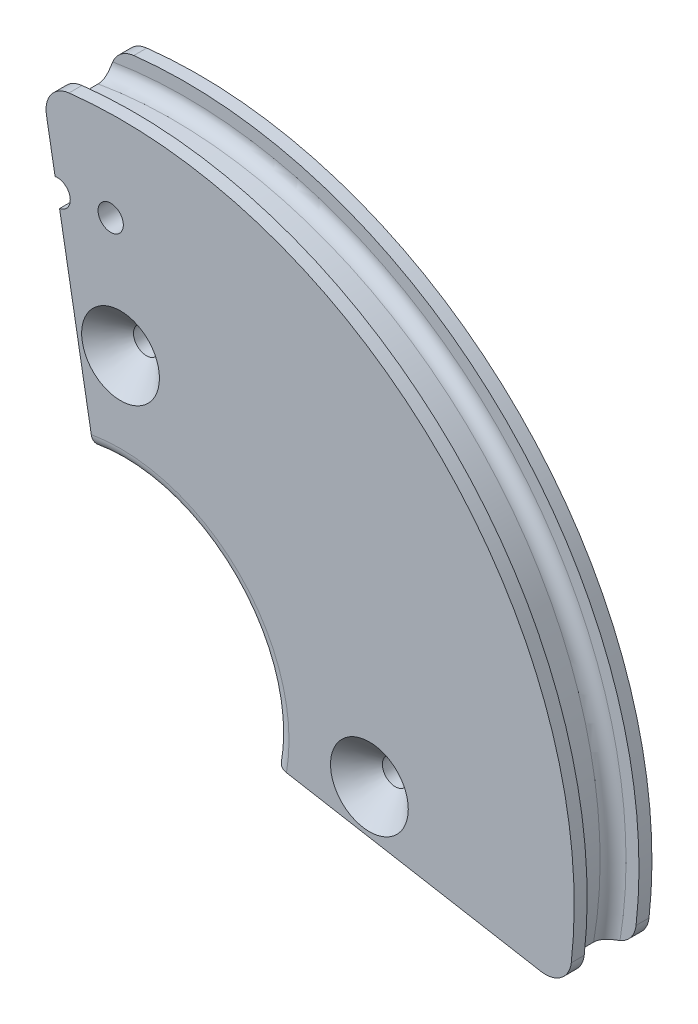
ISO-10303-21;
HEADER;
FILE_DESCRIPTION(('STEP AP214'),'2;1');
FILE_NAME('part.step','',(''),(''),'','','');
FILE_SCHEMA(('AUTOMOTIVE_DESIGN { 1 0 10303 214 1 1 1 1 }'));
ENDSEC;
DATA;
#1=APPLICATION_CONTEXT('core data for automotive mechanical design processes');
#2=APPLICATION_PROTOCOL_DEFINITION('international standard','automotive_design',2000,#1);
#3=PRODUCT_CONTEXT('',#1,'mechanical');
#4=PRODUCT('Part','Part','',(#3));
#5=PRODUCT_RELATED_PRODUCT_CATEGORY('part','',(#4));
#6=PRODUCT_DEFINITION_FORMATION('','',#4);
#7=PRODUCT_DEFINITION_CONTEXT('part definition',#1,'design');
#8=PRODUCT_DEFINITION('design','',#6,#7);
#9=PRODUCT_DEFINITION_SHAPE('','',#8);
#10=(LENGTH_UNIT() NAMED_UNIT(*) SI_UNIT(.MILLI.,.METRE.));
#11=(NAMED_UNIT(*) PLANE_ANGLE_UNIT() SI_UNIT($,.RADIAN.));
#12=(NAMED_UNIT(*) SI_UNIT($,.STERADIAN.) SOLID_ANGLE_UNIT());
#13=UNCERTAINTY_MEASURE_WITH_UNIT(LENGTH_MEASURE(1.E-05),#10,'distance_accuracy_value','');
#14=(GEOMETRIC_REPRESENTATION_CONTEXT(3) GLOBAL_UNCERTAINTY_ASSIGNED_CONTEXT((#13)) GLOBAL_UNIT_ASSIGNED_CONTEXT((#10,
#11,#12)) REPRESENTATION_CONTEXT('',''));
#15=CARTESIAN_POINT('',(0.,0.,0.));
#16=DIRECTION('',(0.,0.,1.));
#17=DIRECTION('',(1.,0.,0.));
#18=AXIS2_PLACEMENT_3D('',#15,#16,#17);
#19=CARTESIAN_POINT('',(-3.30899291015664,18.7662313326156,-1.5));
#20=DIRECTION('',(0.984807753012209,0.173648177666927,0.));
#21=DIRECTION('',(-0.173648177666927,0.984807753012209,0.));
#22=AXIS2_PLACEMENT_3D('',#19,#20,#21);
#23=PLANE('',#22);
#24=DIRECTION('',(-0.173648177666927,0.984807753012209,0.));
#25=VECTOR('',#24,1.);
#26=CARTESIAN_POINT('',(-3.30899291015664,18.7662313326156,1.5));
#27=LINE('',#26,#25);
#28=CARTESIAN_POINT('',(-2.52630446793555,14.3273845998222,1.5));
#29=VERTEX_POINT('',#28);
#30=CARTESIAN_POINT('',(-2.85992802460322,16.2194578113477,1.5));
#31=VERTEX_POINT('',#30);
#32=EDGE_CURVE('E375',#29,#31,#27,.T.);
#33=ORIENTED_EDGE('',*,*,#32,.T.);
#34=DIRECTION('',(0.,0.,-1.));
#35=VECTOR('',#34,1.);
#36=CARTESIAN_POINT('',(-2.85992802460322,16.2194578113477,-1.5));
#37=LINE('',#36,#35);
#38=CARTESIAN_POINT('',(-2.85992802460322,16.2194578113477,-1.5));
#39=VERTEX_POINT('',#38);
#40=EDGE_CURVE('E11',#31,#39,#37,.T.);
#41=ORIENTED_EDGE('',*,*,#40,.T.);
#42=DIRECTION('',(-0.173648177666927,0.984807753012209,0.));
#43=VECTOR('',#42,1.);
#44=CARTESIAN_POINT('',(-3.30899291015664,18.7662313326156,-1.5));
#45=LINE('',#44,#43);
#46=CARTESIAN_POINT('',(-2.52630446793555,14.3273845998222,-1.5));
#47=VERTEX_POINT('',#46);
#48=EDGE_CURVE('E165',#47,#39,#45,.T.);
#49=ORIENTED_EDGE('',*,*,#48,.F.);
#50=DIRECTION('',(0.,0.,1.));
#51=VECTOR('',#50,1.);
#52=CARTESIAN_POINT('',(-2.52630446793555,14.3273845998222,-1.5));
#53=LINE('',#52,#51);
#54=EDGE_CURVE('E148',#47,#29,#53,.T.);
#55=ORIENTED_EDGE('',*,*,#54,.T.);
#56=EDGE_LOOP('',(#33,#41,#49,#55));
#57=FACE_BOUND('',#56,.T.);
#58=ADVANCED_FACE('F34',(#57),#23,.F.);
#59=CARTESIAN_POINT('',(0.,0.,1.5));
#60=DIRECTION('',(0.,0.,1.));
#61=DIRECTION('',(1.,0.,0.));
#62=AXIS2_PLACEMENT_3D('',#59,#60,#61);
#63=PLANE('',#62);
#64=CARTESIAN_POINT('',(9.6,0.,1.5));
#65=DIRECTION('',(0.,0.,1.));
#66=DIRECTION('',(1.,0.,0.));
#67=AXIS2_PLACEMENT_3D('',#64,#65,#66);
#68=CIRCLE('',#67,1.5);
#69=CARTESIAN_POINT('',(11.1,0.,1.5));
#70=VERTEX_POINT('',#69);
#71=EDGE_CURVE('E237',#70,#70,#68,.F.);
#72=ORIENTED_EDGE('',*,*,#71,.T.);
#73=EDGE_LOOP('',(#72));
#74=FACE_BOUND('',#73,.T.);
#75=CARTESIAN_POINT('',(1.00554662558682E-13,9.6,1.5));
#76=DIRECTION('',(0.,0.,1.));
#77=DIRECTION('',(1.,0.,0.));
#78=AXIS2_PLACEMENT_3D('',#75,#76,#77);
#79=CIRCLE('',#78,1.5);
#80=CARTESIAN_POINT('',(1.5000000000001,9.6,1.5));
#81=VERTEX_POINT('',#80);
#82=EDGE_CURVE('E234',#81,#81,#79,.F.);
#83=ORIENTED_EDGE('',*,*,#82,.T.);
#84=EDGE_LOOP('',(#83));
#85=FACE_BOUND('',#84,.T.);
#86=DIRECTION('',(-0.984807753012207,0.173648177666937,0.));
#87=VECTOR('',#86,1.);
#88=CARTESIAN_POINT('',(18.7662313326155,-3.30899291015683,1.5));
#89=LINE('',#88,#87);
#90=CARTESIAN_POINT('',(16.2194578113477,-2.85992802460339,1.5));
#91=VERTEX_POINT('',#90);
#92=CARTESIAN_POINT('',(6.40125039457935,-1.12871315483509,1.5));
#93=VERTEX_POINT('',#92);
#94=EDGE_CURVE('E374',#91,#93,#89,.T.);
#95=ORIENTED_EDGE('',*,*,#94,.F.);
#96=CARTESIAN_POINT('',(16.3931059890146,-1.87512027159118,1.5));
#97=DIRECTION('',(0.,0.,1.));
#98=DIRECTION('',(1.,0.,0.));
#99=AXIS2_PLACEMENT_3D('',#96,#97,#98);
#100=CIRCLE('',#99,1.);
#101=CARTESIAN_POINT('',(17.3866275641064,-1.98876392441489,1.5));
#102=VERTEX_POINT('',#101);
#103=EDGE_CURVE('E248',#91,#102,#100,.T.);
#104=ORIENTED_EDGE('',*,*,#103,.T.);
#105=CARTESIAN_POINT('',(0.,0.,1.5));
#106=DIRECTION('',(0.,0.,1.));
#107=DIRECTION('',(1.,0.,0.));
#108=AXIS2_PLACEMENT_3D('',#105,#106,#107);
#109=CIRCLE('',#108,17.5);
#110=CARTESIAN_POINT('',(-1.98876392441471,17.3866275641065,1.5));
#111=VERTEX_POINT('',#110);
#112=EDGE_CURVE('E186',#102,#111,#109,.T.);
#113=ORIENTED_EDGE('',*,*,#112,.T.);
#114=CARTESIAN_POINT('',(-1.87512027159101,16.3931059890147,1.5));
#115=DIRECTION('',(0.,0.,1.));
#116=DIRECTION('',(1.,0.,0.));
#117=AXIS2_PLACEMENT_3D('',#114,#115,#116);
#118=CIRCLE('',#117,1.);
#119=EDGE_CURVE('E246',#111,#31,#118,.T.);
#120=ORIENTED_EDGE('',*,*,#119,.T.);
#121=ORIENTED_EDGE('',*,*,#32,.F.);
#122=CARTESIAN_POINT('',(-2.43948037910209,13.8349807233161,1.5));
#123=DIRECTION('',(0.,0.,1.));
#124=DIRECTION('',(1.,0.,0.));
#125=AXIS2_PLACEMENT_3D('',#122,#123,#124);
#126=CIRCLE('',#125,0.500000000000001);
#127=CARTESIAN_POINT('',(-2.35265629026863,13.3425768468099,1.5));
#128=VERTEX_POINT('',#127);
#129=EDGE_CURVE('E155',#128,#29,#126,.T.);
#130=ORIENTED_EDGE('',*,*,#129,.F.);
#131=CARTESIAN_POINT('',(-1.12871315483503,6.40125039457936,1.5));
#132=VERTEX_POINT('',#131);
#133=EDGE_CURVE('E174',#132,#128,#27,.T.);
#134=ORIENTED_EDGE('',*,*,#133,.F.);
#135=CARTESIAN_POINT('',(0.,0.,1.5));
#136=DIRECTION('',(0.,0.,1.));
#137=DIRECTION('',(1.,0.,0.));
#138=AXIS2_PLACEMENT_3D('',#135,#136,#137);
#139=CIRCLE('',#138,6.5);
#140=EDGE_CURVE('E221',#132,#93,#139,.F.);
#141=ORIENTED_EDGE('',*,*,#140,.T.);
#142=EDGE_LOOP('',(#95,#104,#113,#120,#121,#130,#134,#141));
#143=FACE_BOUND('',#142,.T.);
#144=CARTESIAN_POINT('',(-0.379844620119436,14.0212871539164,1.5));
#145=DIRECTION('',(0.,0.,1.));
#146=DIRECTION('',(1.,0.,0.));
#147=AXIS2_PLACEMENT_3D('',#144,#145,#146);
#148=CIRCLE('',#147,0.487297939704498);
#149=CARTESIAN_POINT('',(0.107453319585063,14.0212871539164,1.5));
#150=VERTEX_POINT('',#149);
#151=EDGE_CURVE('E378',#150,#150,#148,.T.);
#152=ORIENTED_EDGE('',*,*,#151,.F.);
#153=EDGE_LOOP('',(#152));
#154=FACE_BOUND('',#153,.T.);
#155=ADVANCED_FACE('F326',(#74,#85,#143,#154),#63,.T.);
#156=CARTESIAN_POINT('',(0.,0.,-1.5));
#157=DIRECTION('',(0.,0.,1.));
#158=DIRECTION('',(1.,0.,0.));
#159=AXIS2_PLACEMENT_3D('',#156,#157,#158);
#160=PLANE('',#159);
#161=CARTESIAN_POINT('',(-0.379844620119436,14.0212871539164,-1.5));
#162=DIRECTION('',(0.,0.,1.));
#163=DIRECTION('',(1.,0.,0.));
#164=AXIS2_PLACEMENT_3D('',#161,#162,#163);
#165=CIRCLE('',#164,0.487297939704498);
#166=CARTESIAN_POINT('',(0.107453319585063,14.0212871539164,-1.5));
#167=VERTEX_POINT('',#166);
#168=EDGE_CURVE('E169',#167,#167,#165,.T.);
#169=ORIENTED_EDGE('',*,*,#168,.T.);
#170=EDGE_LOOP('',(#169));
#171=FACE_BOUND('',#170,.T.);
#172=CARTESIAN_POINT('',(0.,0.,-1.5));
#173=DIRECTION('',(0.,0.,1.));
#174=DIRECTION('',(1.,0.,0.));
#175=AXIS2_PLACEMENT_3D('',#172,#173,#174);
#176=CIRCLE('',#175,17.5);
#177=CARTESIAN_POINT('',(17.3866275641064,-1.98876392441489,-1.5));
#178=VERTEX_POINT('',#177);
#179=CARTESIAN_POINT('',(-1.98876392441471,17.3866275641065,-1.5));
#180=VERTEX_POINT('',#179);
#181=EDGE_CURVE('E189',#178,#180,#176,.T.);
#182=ORIENTED_EDGE('',*,*,#181,.F.);
#183=CARTESIAN_POINT('',(16.3931059890146,-1.87512027159118,-1.5));
#184=DIRECTION('',(0.,0.,1.));
#185=DIRECTION('',(1.,0.,0.));
#186=AXIS2_PLACEMENT_3D('',#183,#184,#185);
#187=CIRCLE('',#186,1.);
#188=CARTESIAN_POINT('',(16.2194578113477,-2.85992802460339,-1.5));
#189=VERTEX_POINT('',#188);
#190=EDGE_CURVE('E43',#178,#189,#187,.F.);
#191=ORIENTED_EDGE('',*,*,#190,.T.);
#192=DIRECTION('',(-0.984807753012207,0.173648177666937,0.));
#193=VECTOR('',#192,1.);
#194=CARTESIAN_POINT('',(18.7662313326155,-3.30899291015683,-1.5));
#195=LINE('',#194,#193);
#196=CARTESIAN_POINT('',(6.40125039457935,-1.12871315483509,-1.5));
#197=VERTEX_POINT('',#196);
#198=EDGE_CURVE('E171',#189,#197,#195,.T.);
#199=ORIENTED_EDGE('',*,*,#198,.T.);
#200=CARTESIAN_POINT('',(0.,0.,-1.5));
#201=DIRECTION('',(0.,0.,1.));
#202=DIRECTION('',(1.,0.,0.));
#203=AXIS2_PLACEMENT_3D('',#200,#201,#202);
#204=CIRCLE('',#203,6.5);
#205=CARTESIAN_POINT('',(-1.12871315483503,6.40125039457936,-1.5));
#206=VERTEX_POINT('',#205);
#207=EDGE_CURVE('E229',#197,#206,#204,.T.);
#208=ORIENTED_EDGE('',*,*,#207,.T.);
#209=CARTESIAN_POINT('',(-2.35265629026863,13.3425768468099,-1.5));
#210=VERTEX_POINT('',#209);
#211=EDGE_CURVE('E168',#206,#210,#45,.T.);
#212=ORIENTED_EDGE('',*,*,#211,.T.);
#213=CARTESIAN_POINT('',(-2.43948037910209,13.8349807233161,-1.5));
#214=DIRECTION('',(0.,0.,1.));
#215=DIRECTION('',(1.,0.,0.));
#216=AXIS2_PLACEMENT_3D('',#213,#214,#215);
#217=CIRCLE('',#216,0.500000000000001);
#218=EDGE_CURVE('E152',#210,#47,#217,.T.);
#219=ORIENTED_EDGE('',*,*,#218,.T.);
#220=ORIENTED_EDGE('',*,*,#48,.T.);
#221=CARTESIAN_POINT('',(-1.87512027159101,16.3931059890147,-1.5));
#222=DIRECTION('',(0.,0.,1.));
#223=DIRECTION('',(1.,0.,0.));
#224=AXIS2_PLACEMENT_3D('',#221,#222,#223);
#225=CIRCLE('',#224,1.);
#226=EDGE_CURVE('E50',#39,#180,#225,.F.);
#227=ORIENTED_EDGE('',*,*,#226,.T.);
#228=EDGE_LOOP('',(#182,#191,#199,#208,#212,#219,#220,#227));
#229=FACE_BOUND('',#228,.T.);
#230=CARTESIAN_POINT('',(9.6,0.,-1.5));
#231=DIRECTION('',(0.,0.,1.));
#232=DIRECTION('',(1.,0.,0.));
#233=AXIS2_PLACEMENT_3D('',#230,#231,#232);
#234=CIRCLE('',#233,0.499999999999999);
#235=CARTESIAN_POINT('',(10.1,0.,-1.5));
#236=VERTEX_POINT('',#235);
#237=EDGE_CURVE('E209',#236,#236,#234,.T.);
#238=ORIENTED_EDGE('',*,*,#237,.T.);
#239=EDGE_LOOP('',(#238));
#240=FACE_BOUND('',#239,.T.);
#241=CARTESIAN_POINT('',(1.00554662558682E-13,9.6,-1.5));
#242=DIRECTION('',(0.,0.,1.));
#243=DIRECTION('',(1.,0.,0.));
#244=AXIS2_PLACEMENT_3D('',#241,#242,#243);
#245=CIRCLE('',#244,0.500000000000001);
#246=CARTESIAN_POINT('',(0.500000000000101,9.6,-1.5));
#247=VERTEX_POINT('',#246);
#248=EDGE_CURVE('E206',#247,#247,#245,.T.);
#249=ORIENTED_EDGE('',*,*,#248,.T.);
#250=EDGE_LOOP('',(#249));
#251=FACE_BOUND('',#250,.T.);
#252=ADVANCED_FACE('F163',(#171,#229,#240,#251),#160,.F.);
#253=CARTESIAN_POINT('',(0.,0.,1.5));
#254=DIRECTION('',(0.,0.,-1.));
#255=DIRECTION('',(-1.,0.,0.));
#256=AXIS2_PLACEMENT_3D('',#253,#254,#255);
#257=CYLINDRICAL_SURFACE('',#256,6.);
#258=DIRECTION('',(0.,0.,-1.));
#259=VECTOR('',#258,1.);
#260=CARTESIAN_POINT('',(5.90884651807324,-1.04188906600162,1.5));
#261=LINE('',#260,#259);
#262=CARTESIAN_POINT('',(5.90884651807324,-1.04188906600162,1.));
#263=VERTEX_POINT('',#262);
#264=CARTESIAN_POINT('',(5.90884651807324,-1.04188906600162,-1.));
#265=VERTEX_POINT('',#264);
#266=EDGE_CURVE('E180',#263,#265,#261,.T.);
#267=ORIENTED_EDGE('',*,*,#266,.F.);
#268=CARTESIAN_POINT('',(0.,0.,1.));
#269=DIRECTION('',(0.,0.,1.));
#270=DIRECTION('',(1.,0.,0.));
#271=AXIS2_PLACEMENT_3D('',#268,#269,#270);
#272=CIRCLE('',#271,6.);
#273=CARTESIAN_POINT('',(-1.04188906600156,5.90884651807325,1.));
#274=VERTEX_POINT('',#273);
#275=EDGE_CURVE('E214',#263,#274,#272,.T.);
#276=ORIENTED_EDGE('',*,*,#275,.T.);
#277=DIRECTION('',(0.,0.,-1.));
#278=VECTOR('',#277,1.);
#279=CARTESIAN_POINT('',(-1.04188906600156,5.90884651807325,1.5));
#280=LINE('',#279,#278);
#281=CARTESIAN_POINT('',(-1.04188906600156,5.90884651807325,-1.));
#282=VERTEX_POINT('',#281);
#283=EDGE_CURVE('E173',#282,#274,#280,.F.);
#284=ORIENTED_EDGE('',*,*,#283,.F.);
#285=CARTESIAN_POINT('',(0.,0.,-1.));
#286=DIRECTION('',(0.,0.,1.));
#287=DIRECTION('',(1.,0.,0.));
#288=AXIS2_PLACEMENT_3D('',#285,#286,#287);
#289=CIRCLE('',#288,6.);
#290=EDGE_CURVE('E160',#282,#265,#289,.F.);
#291=ORIENTED_EDGE('',*,*,#290,.T.);
#292=EDGE_LOOP('',(#267,#276,#284,#291));
#293=FACE_BOUND('',#292,.T.);
#294=ADVANCED_FACE('F325',(#293),#257,.F.);
#295=CARTESIAN_POINT('',(9.6,0.,1.5));
#296=DIRECTION('',(0.,0.,-1.));
#297=DIRECTION('',(-1.,0.,0.));
#298=AXIS2_PLACEMENT_3D('',#295,#296,#297);
#299=CYLINDRICAL_SURFACE('',#298,0.499999999999999);
#300=CARTESIAN_POINT('',(9.6,0.,0.499999999999999));
#301=DIRECTION('',(0.,0.,1.));
#302=DIRECTION('',(1.,0.,0.));
#303=AXIS2_PLACEMENT_3D('',#300,#301,#302);
#304=CIRCLE('',#303,0.499999999999999);
#305=CARTESIAN_POINT('',(10.1,0.,0.499999999999999));
#306=VERTEX_POINT('',#305);
#307=EDGE_CURVE('E231',#306,#306,#304,.T.);
#308=ORIENTED_EDGE('',*,*,#307,.T.);
#309=EDGE_LOOP('',(#308));
#310=FACE_BOUND('',#309,.T.);
#311=ORIENTED_EDGE('',*,*,#237,.F.);
#312=EDGE_LOOP('',(#311));
#313=FACE_BOUND('',#312,.T.);
#314=ADVANCED_FACE('F332',(#310,#313),#299,.F.);
#315=CARTESIAN_POINT('',(1.00554662558682E-13,9.6,1.5));
#316=DIRECTION('',(0.,0.,-1.));
#317=DIRECTION('',(-1.,0.,0.));
#318=AXIS2_PLACEMENT_3D('',#315,#316,#317);
#319=CYLINDRICAL_SURFACE('',#318,0.500000000000001);
#320=CARTESIAN_POINT('',(1.00554662558682E-13,9.6,0.500000000000001));
#321=DIRECTION('',(0.,0.,1.));
#322=DIRECTION('',(1.,0.,0.));
#323=AXIS2_PLACEMENT_3D('',#320,#321,#322);
#324=CIRCLE('',#323,0.500000000000001);
#325=CARTESIAN_POINT('',(0.500000000000101,9.6,0.500000000000001));
#326=VERTEX_POINT('',#325);
#327=EDGE_CURVE('E240',#326,#326,#324,.T.);
#328=ORIENTED_EDGE('',*,*,#327,.T.);
#329=EDGE_LOOP('',(#328));
#330=FACE_BOUND('',#329,.T.);
#331=ORIENTED_EDGE('',*,*,#248,.F.);
#332=EDGE_LOOP('',(#331));
#333=FACE_BOUND('',#332,.T.);
#334=ADVANCED_FACE('F282',(#330,#333),#319,.F.);
#335=CARTESIAN_POINT('',(0.,0.,-0.5));
#336=DIRECTION('',(0.,0.,1.));
#337=DIRECTION('',(1.,0.,0.));
#338=AXIS2_PLACEMENT_3D('',#335,#336,#337);
#339=TOROIDAL_SURFACE('',#338,17.,0.5);
#340=CARTESIAN_POINT('',(0.,0.,-0.5));
#341=DIRECTION('',(0.,0.,1.));
#342=DIRECTION('',(1.,0.,0.));
#343=AXIS2_PLACEMENT_3D('',#340,#341,#342);
#344=CIRCLE('',#343,16.5);
#345=CARTESIAN_POINT('',(16.2494078117638,-2.8647418325198,-0.5));
#346=VERTEX_POINT('',#345);
#347=CARTESIAN_POINT('',(-2.86474183251963,16.2494078117639,-0.5));
#348=VERTEX_POINT('',#347);
#349=EDGE_CURVE('E197',#346,#348,#344,.T.);
#350=ORIENTED_EDGE('',*,*,#349,.F.);
#351=CARTESIAN_POINT('',(16.2494078117638,-2.8647418325198,-0.5));
#352=CARTESIAN_POINT('',(16.2493898011126,-2.86470546825929,-0.528003570355387));
#353=CARTESIAN_POINT('',(16.25173578721,-2.86507925705576,-0.556001816585176));
#354=CARTESIAN_POINT('',(16.2610270681884,-2.8663794896479,-0.611206017275342));
#355=CARTESIAN_POINT('',(16.2679714045759,-2.86730581826655,-0.638412135615664));
#356=CARTESIAN_POINT('',(16.2863370301603,-2.86944441260916,-0.691280687187206));
#357=CARTESIAN_POINT('',(16.2977613543491,-2.87065687195174,-0.716942060299504));
#358=CARTESIAN_POINT('',(16.3248142251978,-2.87287821265411,-0.765951355901182));
#359=CARTESIAN_POINT('',(16.3404418273387,-2.87388713966066,-0.789299796518898));
#360=CARTESIAN_POINT('',(16.3752777945772,-2.87511074339554,-0.832725750010852));
#361=CARTESIAN_POINT('',(16.3944413361209,-2.87533472872085,-0.852838880174707));
#362=CARTESIAN_POINT('',(16.4358617374146,-2.87441975002678,-0.889516484471438));
#363=CARTESIAN_POINT('',(16.4581161549459,-2.87328185672469,-0.906083734331567));
#364=CARTESIAN_POINT('',(16.5040074133631,-2.86920767257011,-0.934680734688172));
#365=CARTESIAN_POINT('',(16.5275560028242,-2.86634354495734,-0.946862755717905));
#366=CARTESIAN_POINT('',(16.5759735691311,-2.85856394526026,-0.967415761706771));
#367=CARTESIAN_POINT('',(16.600844067245,-2.8536460630432,-0.975782244823686));
#368=CARTESIAN_POINT('',(16.6495528689569,-2.84198258334568,-0.988381038898608));
#369=CARTESIAN_POINT('',(16.6733672166417,-2.83535974250368,-0.992825257841224));
#370=CARTESIAN_POINT('',(16.720727873261,-2.82026214471509,-0.998639776338432));
#371=CARTESIAN_POINT('',(16.7442746709801,-2.81179166173799,-1.00001708918693));
#372=CARTESIAN_POINT('',(16.7674217871636,-2.80242156203355,-1.));
#373=B_SPLINE_CURVE_WITH_KNOTS('',3,(#351,#352,#353,#354,#355,#356,#357,#358,#359,#360,#361,
#362,#363,#364,#365,#366,#367,#368,#369,#370,#371,#372),.UNSPECIFIED.,.F.,.F.,(4,2,2,2,2,2,2,2,
2,2,4),(0.,0.0839029754345774,0.167788467389257,0.251730886471917,0.335654458584859,
0.418579351868464,0.501439091899557,0.581054350665933,0.660763303667048,0.735842311772023,
0.810749454733215),.UNSPECIFIED.);
#374=CARTESIAN_POINT('',(16.7674217871636,-2.80242156203352,-1.));
#375=VERTEX_POINT('',#374);
#376=EDGE_CURVE('E293',#346,#375,#373,.T.);
#377=ORIENTED_EDGE('',*,*,#376,.T.);
#378=CARTESIAN_POINT('',(0.,0.,-1.));
#379=DIRECTION('',(0.,0.,1.));
#380=DIRECTION('',(1.,0.,0.));
#381=AXIS2_PLACEMENT_3D('',#378,#379,#380);
#382=CIRCLE('',#381,17.);
#383=CARTESIAN_POINT('',(-2.80242156203338,16.7674217871637,-1.));
#384=VERTEX_POINT('',#383);
#385=EDGE_CURVE('E194',#375,#384,#382,.T.);
#386=ORIENTED_EDGE('',*,*,#385,.T.);
#387=CARTESIAN_POINT('',(-2.80242156203338,16.7674217871637,-1.));
#388=CARTESIAN_POINT('',(-2.81302079826154,16.7412767330537,-1.00003201610107));
#389=CARTESIAN_POINT('',(-2.82245706922161,16.7146019364943,-0.998265044468732));
#390=CARTESIAN_POINT('',(-2.83895864753731,16.6610244726877,-0.990780051831145));
#391=CARTESIAN_POINT('',(-2.84601931713423,16.6341214636318,-0.985054368221891));
#392=CARTESIAN_POINT('',(-2.85770774775289,16.5809150333108,-0.969262652416946));
#393=CARTESIAN_POINT('',(-2.86232506960025,16.5546146368567,-0.959178325744923));
#394=CARTESIAN_POINT('',(-2.86929926235011,16.5038440782467,-0.934679705770554));
#395=CARTESIAN_POINT('',(-2.87166009067922,16.479370781507,-0.920273051483044));
#396=CARTESIAN_POINT('',(-2.87448698691641,16.4347444861277,-0.888540439466409));
#397=CARTESIAN_POINT('',(-2.87507007809463,16.4144114491036,-0.871476815494054));
#398=CARTESIAN_POINT('',(-2.87516430220007,16.37676564223,-0.834271964711967));
#399=CARTESIAN_POINT('',(-2.87467474890472,16.3594548134823,-0.814128775423813));
#400=CARTESIAN_POINT('',(-2.87313640264398,16.32820921109,-0.771146891956581));
#401=CARTESIAN_POINT('',(-2.87208307150598,16.3143031876514,-0.748287512046782));
#402=CARTESIAN_POINT('',(-2.86990166900754,16.2903735254986,-0.700625099813418));
#403=CARTESIAN_POINT('',(-2.86877359748538,16.2803498951854,-0.6758220632842));
#404=CARTESIAN_POINT('',(-2.86688152931237,16.2647630835108,-0.626097527282585));
#405=CARTESIAN_POINT('',(-2.86610317326767,16.2590159457846,-0.601233950640481));
#406=CARTESIAN_POINT('',(-2.86502083725175,16.2513324990289,-0.550915280895252));
#407=CARTESIAN_POINT('',(-2.86471685477311,16.2493961698563,-0.525460190919449));
#408=CARTESIAN_POINT('',(-2.86474183251963,16.2494078117639,-0.499999999999999));
#409=B_SPLINE_CURVE_WITH_KNOTS('',3,(#387,#388,#389,#390,#391,#392,#393,#394,#395,#396,#397,
#398,#399,#400,#401,#402,#403,#404,#405,#406,#407,#408),.UNSPECIFIED.,.F.,.F.,(4,2,2,2,2,2,2,2,
2,2,4),(0.,0.0846346048995906,0.169433491451253,0.254591813299032,0.339600509387528,
0.418877403400489,0.498205029485345,0.578181030181556,0.658157203933339,0.734454796576753,
0.810751985927846),.UNSPECIFIED.);
#410=EDGE_CURVE('E287',#384,#348,#409,.T.);
#411=ORIENTED_EDGE('',*,*,#410,.T.);
#412=EDGE_LOOP('',(#350,#377,#386,#411));
#413=FACE_BOUND('',#412,.T.);
#414=ADVANCED_FACE('F275',(#413),#339,.F.);
#415=CARTESIAN_POINT('',(0.,0.,0.5));
#416=DIRECTION('',(0.,0.,1.));
#417=DIRECTION('',(1.,0.,0.));
#418=AXIS2_PLACEMENT_3D('',#415,#416,#417);
#419=TOROIDAL_SURFACE('',#418,17.,0.5);
#420=CARTESIAN_POINT('',(0.,0.,1.));
#421=DIRECTION('',(0.,0.,1.));
#422=DIRECTION('',(1.,0.,0.));
#423=AXIS2_PLACEMENT_3D('',#420,#421,#422);
#424=CIRCLE('',#423,17.);
#425=CARTESIAN_POINT('',(16.7674217871636,-2.80242156203355,1.));
#426=VERTEX_POINT('',#425);
#427=CARTESIAN_POINT('',(-2.80242156203335,16.7674217871637,1.));
#428=VERTEX_POINT('',#427);
#429=EDGE_CURVE('E203',#426,#428,#424,.T.);
#430=ORIENTED_EDGE('',*,*,#429,.F.);
#431=CARTESIAN_POINT('',(16.7674217871636,-2.80242156203355,1.));
#432=CARTESIAN_POINT('',(16.7412767330537,-2.81302079826171,1.00003201610107));
#433=CARTESIAN_POINT('',(16.7146019364943,-2.82245706922178,0.998265044468732));
#434=CARTESIAN_POINT('',(16.6610244726877,-2.83895864753748,0.990780051831144));
#435=CARTESIAN_POINT('',(16.6341214636317,-2.8460193171344,0.98505436822189));
#436=CARTESIAN_POINT('',(16.5809150333108,-2.85770774775306,0.969262652416946));
#437=CARTESIAN_POINT('',(16.5546146368566,-2.86232506960042,0.959178325744924));
#438=CARTESIAN_POINT('',(16.5038440782466,-2.86929926235028,0.934679705770554));
#439=CARTESIAN_POINT('',(16.479370781507,-2.87166009067939,0.920273051483043));
#440=CARTESIAN_POINT('',(16.4347444861276,-2.87448698691658,0.888540439466407));
#441=CARTESIAN_POINT('',(16.4144114491036,-2.8750700780948,0.871476815494052));
#442=CARTESIAN_POINT('',(16.37676564223,-2.87516430220023,0.834271964711968));
#443=CARTESIAN_POINT('',(16.3594548134823,-2.87467474890489,0.814128775423817));
#444=CARTESIAN_POINT('',(16.32820921109,-2.87313640264415,0.771146891956585));
#445=CARTESIAN_POINT('',(16.3143031876514,-2.87208307150615,0.748287512046785));
#446=CARTESIAN_POINT('',(16.2903735254986,-2.86990166900771,0.70062509981342));
#447=CARTESIAN_POINT('',(16.2803498951853,-2.86877359748555,0.675822063284201));
#448=CARTESIAN_POINT('',(16.2647630835108,-2.86688152931254,0.626097527282586));
#449=CARTESIAN_POINT('',(16.2590159457845,-2.86610317326783,0.601233950640482));
#450=CARTESIAN_POINT('',(16.2513324990288,-2.86502083725192,0.550915280895253));
#451=CARTESIAN_POINT('',(16.2493961698563,-2.86471685477328,0.525460190919449));
#452=CARTESIAN_POINT('',(16.2494078117638,-2.8647418325198,0.499999999999999));
#453=B_SPLINE_CURVE_WITH_KNOTS('',3,(#431,#432,#433,#434,#435,#436,#437,#438,#439,#440,#441,
#442,#443,#444,#445,#446,#447,#448,#449,#450,#451,#452),.UNSPECIFIED.,.F.,.F.,(4,2,2,2,2,2,2,2,
2,2,4),(0.,0.0846346048995903,0.169433491451253,0.254591813299031,0.339600509387532,
0.418877403400492,0.498205029485341,0.578181030181552,0.658157203933338,0.734454796576753,
0.810751985927845),.UNSPECIFIED.);
#454=CARTESIAN_POINT('',(16.2494078117638,-2.8647418325198,0.5));
#455=VERTEX_POINT('',#454);
#456=EDGE_CURVE('E264',#426,#455,#453,.T.);
#457=ORIENTED_EDGE('',*,*,#456,.T.);
#458=CARTESIAN_POINT('',(0.,0.,0.5));
#459=DIRECTION('',(0.,0.,1.));
#460=DIRECTION('',(1.,0.,0.));
#461=AXIS2_PLACEMENT_3D('',#458,#459,#460);
#462=CIRCLE('',#461,16.5);
#463=CARTESIAN_POINT('',(-2.86474183251963,16.2494078117639,0.5));
#464=VERTEX_POINT('',#463);
#465=EDGE_CURVE('E200',#455,#464,#462,.T.);
#466=ORIENTED_EDGE('',*,*,#465,.T.);
#467=CARTESIAN_POINT('',(-2.86474183251963,16.2494078117639,0.5));
#468=CARTESIAN_POINT('',(-2.86470546825912,16.2493898011126,0.528003570355386));
#469=CARTESIAN_POINT('',(-2.8650792570556,16.25173578721,0.556001816585176));
#470=CARTESIAN_POINT('',(-2.86637948964773,16.2610270681885,0.611206017275341));
#471=CARTESIAN_POINT('',(-2.86730581826638,16.2679714045759,0.638412135615663));
#472=CARTESIAN_POINT('',(-2.869444412609,16.2863370301603,0.691280687187206));
#473=CARTESIAN_POINT('',(-2.87065687195157,16.2977613543492,0.716942060299505));
#474=CARTESIAN_POINT('',(-2.87287821265395,16.3248142251978,0.765951355901182));
#475=CARTESIAN_POINT('',(-2.87388713966049,16.3404418273387,0.789299796518897));
#476=CARTESIAN_POINT('',(-2.87511074339537,16.3752777945772,0.832725750010848));
#477=CARTESIAN_POINT('',(-2.87533472872068,16.3944413361209,0.852838880174704));
#478=CARTESIAN_POINT('',(-2.87441975002661,16.4358617374146,0.889516484471436));
#479=CARTESIAN_POINT('',(-2.87328185672453,16.4581161549459,0.906083734331566));
#480=CARTESIAN_POINT('',(-2.86920767256994,16.5040074133631,0.934680734688173));
#481=CARTESIAN_POINT('',(-2.86634354495717,16.5275560028242,0.946862755717906));
#482=CARTESIAN_POINT('',(-2.85856394526009,16.5759735691311,0.967415761706772));
#483=CARTESIAN_POINT('',(-2.85364606304303,16.600844067245,0.975782244823687));
#484=CARTESIAN_POINT('',(-2.84198258334551,16.649552868957,0.988381038898609));
#485=CARTESIAN_POINT('',(-2.83535974250351,16.6733672166418,0.992825257841226));
#486=CARTESIAN_POINT('',(-2.82026214471492,16.720727873261,0.998639776338432));
#487=CARTESIAN_POINT('',(-2.81179166173782,16.7442746709801,1.00001708918693));
#488=CARTESIAN_POINT('',(-2.80242156203338,16.7674217871637,1.));
#489=B_SPLINE_CURVE_WITH_KNOTS('',3,(#467,#468,#469,#470,#471,#472,#473,#474,#475,#476,#477,
#478,#479,#480,#481,#482,#483,#484,#485,#486,#487,#488),.UNSPECIFIED.,.F.,.F.,(4,2,2,2,2,2,2,2,
2,2,4),(0.,0.083902975434577,0.167788467389255,0.251730886471918,0.335654458584855,
0.418579351868461,0.501439091899556,0.581054350665936,0.660763303667051,0.73584231177203,
0.810749454733215),.UNSPECIFIED.);
#490=EDGE_CURVE('E258',#464,#428,#489,.T.);
#491=ORIENTED_EDGE('',*,*,#490,.T.);
#492=EDGE_LOOP('',(#430,#457,#466,#491));
#493=FACE_BOUND('',#492,.T.);
#494=ADVANCED_FACE('F269',(#493),#419,.F.);
#495=CARTESIAN_POINT('',(0.,0.,0.));
#496=DIRECTION('',(0.,0.,1.));
#497=DIRECTION('',(1.,0.,0.));
#498=AXIS2_PLACEMENT_3D('',#495,#496,#497);
#499=CYLINDRICAL_SURFACE('',#498,16.5);
#500=ORIENTED_EDGE('',*,*,#465,.F.);
#501=DIRECTION('',(0.,0.,1.));
#502=VECTOR('',#501,1.);
#503=CARTESIAN_POINT('',(16.2494078117638,-2.8647418325198,0.5));
#504=LINE('',#503,#502);
#505=EDGE_CURVE('E451',#455,#346,#504,.F.);
#506=ORIENTED_EDGE('',*,*,#505,.T.);
#507=ORIENTED_EDGE('',*,*,#349,.T.);
#508=DIRECTION('',(0.,0.,1.));
#509=VECTOR('',#508,1.);
#510=CARTESIAN_POINT('',(-2.86474183251963,16.2494078117639,-0.5));
#511=LINE('',#510,#509);
#512=EDGE_CURVE('E452',#348,#464,#511,.T.);
#513=ORIENTED_EDGE('',*,*,#512,.T.);
#514=EDGE_LOOP('',(#500,#506,#507,#513));
#515=FACE_BOUND('',#514,.T.);
#516=ADVANCED_FACE('F274',(#515),#499,.T.);
#517=CARTESIAN_POINT('',(17.,0.,-1.));
#518=DIRECTION('',(0.,0.,1.));
#519=DIRECTION('',(1.,0.,0.));
#520=AXIS2_PLACEMENT_3D('',#517,#518,#519);
#521=PLANE('',#520);
#522=ORIENTED_EDGE('',*,*,#385,.F.);
#523=CARTESIAN_POINT('',(16.3931059890146,-1.87512027159118,-1.));
#524=DIRECTION('',(0.,0.,1.));
#525=DIRECTION('',(1.,0.,0.));
#526=AXIS2_PLACEMENT_3D('',#523,#524,#525);
#527=CIRCLE('',#526,1.);
#528=CARTESIAN_POINT('',(17.3866275641064,-1.98876392441489,-1.));
#529=VERTEX_POINT('',#528);
#530=EDGE_CURVE('E428',#375,#529,#527,.T.);
#531=ORIENTED_EDGE('',*,*,#530,.T.);
#532=CARTESIAN_POINT('',(0.,0.,-1.));
#533=DIRECTION('',(0.,0.,1.));
#534=DIRECTION('',(1.,0.,0.));
#535=AXIS2_PLACEMENT_3D('',#532,#533,#534);
#536=CIRCLE('',#535,17.5);
#537=CARTESIAN_POINT('',(-1.98876392441471,17.3866275641065,-1.));
#538=VERTEX_POINT('',#537);
#539=EDGE_CURVE('E191',#529,#538,#536,.T.);
#540=ORIENTED_EDGE('',*,*,#539,.T.);
#541=CARTESIAN_POINT('',(-1.87512027159101,16.3931059890147,-1.));
#542=DIRECTION('',(0.,0.,1.));
#543=DIRECTION('',(1.,0.,0.));
#544=AXIS2_PLACEMENT_3D('',#541,#542,#543);
#545=CIRCLE('',#544,1.);
#546=EDGE_CURVE('E298',#538,#384,#545,.T.);
#547=ORIENTED_EDGE('',*,*,#546,.T.);
#548=EDGE_LOOP('',(#522,#531,#540,#547));
#549=FACE_BOUND('',#548,.T.);
#550=ADVANCED_FACE('F456',(#549),#521,.T.);
#551=CARTESIAN_POINT('',(0.,0.,0.));
#552=DIRECTION('',(0.,0.,1.));
#553=DIRECTION('',(1.,0.,0.));
#554=AXIS2_PLACEMENT_3D('',#551,#552,#553);
#555=CYLINDRICAL_SURFACE('',#554,17.5);
#556=ORIENTED_EDGE('',*,*,#539,.F.);
#557=DIRECTION('',(0.,0.,1.));
#558=VECTOR('',#557,1.);
#559=CARTESIAN_POINT('',(17.3866275641064,-1.98876392441489,-1.25));
#560=LINE('',#559,#558);
#561=EDGE_CURVE('E431',#529,#178,#560,.F.);
#562=ORIENTED_EDGE('',*,*,#561,.T.);
#563=ORIENTED_EDGE('',*,*,#181,.T.);
#564=DIRECTION('',(0.,0.,1.));
#565=VECTOR('',#564,1.);
#566=CARTESIAN_POINT('',(-1.98876392441471,17.3866275641065,0.));
#567=LINE('',#566,#565);
#568=EDGE_CURVE('E424',#180,#538,#567,.T.);
#569=ORIENTED_EDGE('',*,*,#568,.T.);
#570=EDGE_LOOP('',(#556,#562,#563,#569));
#571=FACE_BOUND('',#570,.T.);
#572=ADVANCED_FACE('F460',(#571),#555,.T.);
#573=CARTESIAN_POINT('',(0.,0.,0.));
#574=DIRECTION('',(0.,0.,1.));
#575=DIRECTION('',(1.,0.,0.));
#576=AXIS2_PLACEMENT_3D('',#573,#574,#575);
#577=CYLINDRICAL_SURFACE('',#576,17.5);
#578=ORIENTED_EDGE('',*,*,#112,.F.);
#579=DIRECTION('',(0.,0.,1.));
#580=VECTOR('',#579,1.);
#581=CARTESIAN_POINT('',(17.3866275641064,-1.98876392441489,0.));
#582=LINE('',#581,#580);
#583=CARTESIAN_POINT('',(17.3866275641064,-1.98876392441489,1.));
#584=VERTEX_POINT('',#583);
#585=EDGE_CURVE('E252',#102,#584,#582,.F.);
#586=ORIENTED_EDGE('',*,*,#585,.T.);
#587=CARTESIAN_POINT('',(0.,0.,1.));
#588=DIRECTION('',(0.,0.,1.));
#589=DIRECTION('',(1.,0.,0.));
#590=AXIS2_PLACEMENT_3D('',#587,#588,#589);
#591=CIRCLE('',#590,17.5);
#592=CARTESIAN_POINT('',(-1.98876392441471,17.3866275641065,1.));
#593=VERTEX_POINT('',#592);
#594=EDGE_CURVE('E183',#584,#593,#591,.T.);
#595=ORIENTED_EDGE('',*,*,#594,.T.);
#596=DIRECTION('',(0.,0.,1.));
#597=VECTOR('',#596,1.);
#598=CARTESIAN_POINT('',(-1.98876392441471,17.3866275641065,1.25));
#599=LINE('',#598,#597);
#600=EDGE_CURVE('E250',#593,#111,#599,.T.);
#601=ORIENTED_EDGE('',*,*,#600,.T.);
#602=EDGE_LOOP('',(#578,#586,#595,#601));
#603=FACE_BOUND('',#602,.T.);
#604=ADVANCED_FACE('F357',(#603),#577,.T.);
#605=CARTESIAN_POINT('',(17.,0.,1.));
#606=DIRECTION('',(0.,0.,-1.));
#607=DIRECTION('',(-1.,0.,0.));
#608=AXIS2_PLACEMENT_3D('',#605,#606,#607);
#609=PLANE('',#608);
#610=ORIENTED_EDGE('',*,*,#594,.F.);
#611=CARTESIAN_POINT('',(16.3931059890146,-1.87512027159118,1.));
#612=DIRECTION('',(0.,0.,-1.));
#613=DIRECTION('',(-1.,0.,0.));
#614=AXIS2_PLACEMENT_3D('',#611,#612,#613);
#615=CIRCLE('',#614,1.);
#616=EDGE_CURVE('E256',#584,#426,#615,.T.);
#617=ORIENTED_EDGE('',*,*,#616,.T.);
#618=ORIENTED_EDGE('',*,*,#429,.T.);
#619=CARTESIAN_POINT('',(-1.87512027159101,16.3931059890147,1.));
#620=DIRECTION('',(0.,0.,-1.));
#621=DIRECTION('',(-1.,0.,0.));
#622=AXIS2_PLACEMENT_3D('',#619,#620,#621);
#623=CIRCLE('',#622,1.);
#624=EDGE_CURVE('E254',#428,#593,#623,.T.);
#625=ORIENTED_EDGE('',*,*,#624,.T.);
#626=EDGE_LOOP('',(#610,#617,#618,#625));
#627=FACE_BOUND('',#626,.T.);
#628=ADVANCED_FACE('F350',(#627),#609,.T.);
#629=ORIENTED_EDGE('',*,*,#283,.T.);
#630=CARTESIAN_POINT('',(-1.12871315483503,6.40125039457936,1.));
#631=DIRECTION('',(0.984807753012209,0.173648177666927,0.));
#632=DIRECTION('',(-0.173648177666927,0.984807753012209,0.));
#633=AXIS2_PLACEMENT_3D('',#630,#631,#632);
#634=CIRCLE('',#633,0.5);
#635=EDGE_CURVE('E219',#274,#132,#634,.F.);
#636=ORIENTED_EDGE('',*,*,#635,.T.);
#637=ORIENTED_EDGE('',*,*,#133,.T.);
#638=DIRECTION('',(0.,0.,1.));
#639=VECTOR('',#638,1.);
#640=CARTESIAN_POINT('',(-2.35265629026863,13.3425768468099,-1.5));
#641=LINE('',#640,#639);
#642=EDGE_CURVE('E161',#128,#210,#641,.F.);
#643=ORIENTED_EDGE('',*,*,#642,.T.);
#644=ORIENTED_EDGE('',*,*,#211,.F.);
#645=CARTESIAN_POINT('',(-1.12871315483503,6.40125039457936,-1.));
#646=DIRECTION('',(0.984807753012209,0.173648177666927,0.));
#647=DIRECTION('',(-0.173648177666927,0.984807753012209,0.));
#648=AXIS2_PLACEMENT_3D('',#645,#646,#647);
#649=CIRCLE('',#648,0.5);
#650=EDGE_CURVE('E217',#206,#282,#649,.F.);
#651=ORIENTED_EDGE('',*,*,#650,.T.);
#652=EDGE_LOOP('',(#629,#636,#637,#643,#644,#651));
#653=FACE_BOUND('',#652,.T.);
#654=ADVANCED_FACE('F343',(#653),#23,.F.);
#655=CARTESIAN_POINT('',(18.7662313326155,-3.30899291015683,-1.5));
#656=DIRECTION('',(0.173648177666937,0.984807753012207,0.));
#657=DIRECTION('',(-0.984807753012207,0.173648177666937,0.));
#658=AXIS2_PLACEMENT_3D('',#655,#656,#657);
#659=PLANE('',#658);
#660=ORIENTED_EDGE('',*,*,#198,.F.);
#661=DIRECTION('',(0.,0.,-1.));
#662=VECTOR('',#661,1.);
#663=CARTESIAN_POINT('',(16.2194578113477,-2.85992802460339,1.5));
#664=LINE('',#663,#662);
#665=EDGE_CURVE('E243',#189,#91,#664,.F.);
#666=ORIENTED_EDGE('',*,*,#665,.T.);
#667=ORIENTED_EDGE('',*,*,#94,.T.);
#668=CARTESIAN_POINT('',(6.40125039457935,-1.12871315483509,1.));
#669=DIRECTION('',(0.173648177666937,0.984807753012207,0.));
#670=DIRECTION('',(-0.984807753012207,0.173648177666937,0.));
#671=AXIS2_PLACEMENT_3D('',#668,#669,#670);
#672=CIRCLE('',#671,0.5);
#673=EDGE_CURVE('E227',#93,#263,#672,.F.);
#674=ORIENTED_EDGE('',*,*,#673,.T.);
#675=ORIENTED_EDGE('',*,*,#266,.T.);
#676=CARTESIAN_POINT('',(6.40125039457935,-1.12871315483509,-1.));
#677=DIRECTION('',(0.173648177666937,0.984807753012207,0.));
#678=DIRECTION('',(-0.984807753012207,0.173648177666937,0.));
#679=AXIS2_PLACEMENT_3D('',#676,#677,#678);
#680=CIRCLE('',#679,0.5);
#681=EDGE_CURVE('E224',#265,#197,#680,.F.);
#682=ORIENTED_EDGE('',*,*,#681,.T.);
#683=EDGE_LOOP('',(#660,#666,#667,#674,#675,#682));
#684=FACE_BOUND('',#683,.T.);
#685=ADVANCED_FACE('F349',(#684),#659,.F.);
#686=CARTESIAN_POINT('',(-2.43948037910209,13.8349807233161,-1.5));
#687=DIRECTION('',(0.,0.,1.));
#688=DIRECTION('',(1.,0.,0.));
#689=AXIS2_PLACEMENT_3D('',#686,#687,#688);
#690=CYLINDRICAL_SURFACE('',#689,0.500000000000001);
#691=ORIENTED_EDGE('',*,*,#218,.F.);
#692=ORIENTED_EDGE('',*,*,#642,.F.);
#693=ORIENTED_EDGE('',*,*,#129,.T.);
#694=ORIENTED_EDGE('',*,*,#54,.F.);
#695=EDGE_LOOP('',(#691,#692,#693,#694));
#696=FACE_BOUND('',#695,.T.);
#697=ADVANCED_FACE('F150',(#696),#690,.F.);
#698=CARTESIAN_POINT('',(-0.379844620119436,14.0212871539164,-1.5));
#699=DIRECTION('',(0.,0.,1.));
#700=DIRECTION('',(1.,0.,0.));
#701=AXIS2_PLACEMENT_3D('',#698,#699,#700);
#702=CYLINDRICAL_SURFACE('',#701,0.487297939704498);
#703=ORIENTED_EDGE('',*,*,#151,.T.);
#704=EDGE_LOOP('',(#703));
#705=FACE_BOUND('',#704,.T.);
#706=ORIENTED_EDGE('',*,*,#168,.F.);
#707=EDGE_LOOP('',(#706));
#708=FACE_BOUND('',#707,.T.);
#709=ADVANCED_FACE('F321',(#705,#708),#702,.F.);
#710=CARTESIAN_POINT('',(0.,0.,1.));
#711=DIRECTION('',(0.,0.,1.));
#712=DIRECTION('',(1.,0.,0.));
#713=AXIS2_PLACEMENT_3D('',#710,#711,#712);
#714=TOROIDAL_SURFACE('',#713,6.5,0.5);
#715=ORIENTED_EDGE('',*,*,#673,.F.);
#716=ORIENTED_EDGE('',*,*,#140,.F.);
#717=ORIENTED_EDGE('',*,*,#635,.F.);
#718=ORIENTED_EDGE('',*,*,#275,.F.);
#719=EDGE_LOOP('',(#715,#716,#717,#718));
#720=FACE_BOUND('',#719,.T.);
#721=ADVANCED_FACE('F317',(#720),#714,.T.);
#722=CARTESIAN_POINT('',(0.,0.,-1.));
#723=DIRECTION('',(0.,0.,1.));
#724=DIRECTION('',(1.,0.,0.));
#725=AXIS2_PLACEMENT_3D('',#722,#723,#724);
#726=TOROIDAL_SURFACE('',#725,6.5,0.5);
#727=ORIENTED_EDGE('',*,*,#681,.F.);
#728=ORIENTED_EDGE('',*,*,#290,.F.);
#729=ORIENTED_EDGE('',*,*,#650,.F.);
#730=ORIENTED_EDGE('',*,*,#207,.F.);
#731=EDGE_LOOP('',(#727,#728,#729,#730));
#732=FACE_BOUND('',#731,.T.);
#733=ADVANCED_FACE('F313',(#732),#726,.T.);
#734=CARTESIAN_POINT('',(9.6,0.,0.499999999999999));
#735=DIRECTION('',(0.,0.,1.));
#736=DIRECTION('',(1.,0.,0.));
#737=AXIS2_PLACEMENT_3D('',#734,#735,#736);
#738=CONICAL_SURFACE('',#737,0.499999999999999,0.785398163397449);
#739=CARTESIAN_POINT('',(11.1,0.,1.5));
#740=CARTESIAN_POINT('',(11.0895833333333,0.,1.48958333333333));
#741=CARTESIAN_POINT('',(11.0791666666667,0.,1.47916666666667));
#742=CARTESIAN_POINT('',(11.0583333333333,0.,1.45833333333333));
#743=CARTESIAN_POINT('',(11.0479166666667,0.,1.44791666666667));
#744=CARTESIAN_POINT('',(11.0270833333333,0.,1.42708333333333));
#745=CARTESIAN_POINT('',(11.0166666666667,0.,1.41666666666667));
#746=CARTESIAN_POINT('',(10.9958333333333,0.,1.39583333333333));
#747=CARTESIAN_POINT('',(10.9854166666667,0.,1.38541666666667));
#748=CARTESIAN_POINT('',(10.9645833333333,0.,1.36458333333333));
#749=CARTESIAN_POINT('',(10.9541666666667,0.,1.35416666666667));
#750=CARTESIAN_POINT('',(10.9333333333333,0.,1.33333333333333));
#751=CARTESIAN_POINT('',(10.9229166666667,0.,1.32291666666667));
#752=CARTESIAN_POINT('',(10.9020833333333,0.,1.30208333333333));
#753=CARTESIAN_POINT('',(10.8916666666667,0.,1.29166666666667));
#754=CARTESIAN_POINT('',(10.8708333333333,0.,1.27083333333333));
#755=CARTESIAN_POINT('',(10.8604166666667,0.,1.26041666666667));
#756=CARTESIAN_POINT('',(10.8395833333333,0.,1.23958333333333));
#757=CARTESIAN_POINT('',(10.8291666666667,0.,1.22916666666667));
#758=CARTESIAN_POINT('',(10.8083333333333,0.,1.20833333333333));
#759=CARTESIAN_POINT('',(10.7979166666667,0.,1.19791666666667));
#760=CARTESIAN_POINT('',(10.7770833333333,0.,1.17708333333333));
#761=CARTESIAN_POINT('',(10.7666666666667,0.,1.16666666666667));
#762=CARTESIAN_POINT('',(10.7458333333333,0.,1.14583333333333));
#763=CARTESIAN_POINT('',(10.7354166666667,0.,1.13541666666667));
#764=CARTESIAN_POINT('',(10.7145833333333,0.,1.11458333333333));
#765=CARTESIAN_POINT('',(10.7041666666667,0.,1.10416666666667));
#766=CARTESIAN_POINT('',(10.6833333333333,0.,1.08333333333333));
#767=CARTESIAN_POINT('',(10.6729166666667,0.,1.07291666666667));
#768=CARTESIAN_POINT('',(10.6520833333333,0.,1.05208333333333));
#769=CARTESIAN_POINT('',(10.6416666666667,0.,1.04166666666667));
#770=CARTESIAN_POINT('',(10.6208333333333,0.,1.02083333333333));
#771=CARTESIAN_POINT('',(10.6104166666667,0.,1.01041666666667));
#772=CARTESIAN_POINT('',(10.5895833333333,0.,0.989583333333333));
#773=CARTESIAN_POINT('',(10.5791666666667,0.,0.979166666666666));
#774=CARTESIAN_POINT('',(10.5583333333333,0.,0.958333333333333));
#775=CARTESIAN_POINT('',(10.5479166666667,0.,0.947916666666666));
#776=CARTESIAN_POINT('',(10.5270833333333,0.,0.927083333333333));
#777=CARTESIAN_POINT('',(10.5166666666667,0.,0.916666666666666));
#778=CARTESIAN_POINT('',(10.4958333333333,0.,0.895833333333333));
#779=CARTESIAN_POINT('',(10.4854166666667,0.,0.885416666666666));
#780=CARTESIAN_POINT('',(10.4645833333333,0.,0.864583333333333));
#781=CARTESIAN_POINT('',(10.4541666666667,0.,0.854166666666666));
#782=CARTESIAN_POINT('',(10.4333333333333,0.,0.833333333333333));
#783=CARTESIAN_POINT('',(10.4229166666667,0.,0.822916666666666));
#784=CARTESIAN_POINT('',(10.4020833333333,0.,0.802083333333333));
#785=CARTESIAN_POINT('',(10.3916666666667,0.,0.791666666666666));
#786=CARTESIAN_POINT('',(10.3708333333333,0.,0.770833333333333));
#787=CARTESIAN_POINT('',(10.3604166666667,0.,0.760416666666666));
#788=CARTESIAN_POINT('',(10.3395833333333,0.,0.739583333333333));
#789=CARTESIAN_POINT('',(10.3291666666667,0.,0.729166666666666));
#790=CARTESIAN_POINT('',(10.3083333333333,0.,0.708333333333333));
#791=CARTESIAN_POINT('',(10.2979166666667,0.,0.697916666666666));
#792=CARTESIAN_POINT('',(10.2770833333333,0.,0.677083333333333));
#793=CARTESIAN_POINT('',(10.2666666666667,0.,0.666666666666666));
#794=CARTESIAN_POINT('',(10.2458333333333,0.,0.645833333333333));
#795=CARTESIAN_POINT('',(10.2354166666667,0.,0.635416666666666));
#796=CARTESIAN_POINT('',(10.2145833333333,0.,0.614583333333333));
#797=CARTESIAN_POINT('',(10.2041666666667,0.,0.604166666666666));
#798=CARTESIAN_POINT('',(10.1833333333333,0.,0.583333333333333));
#799=CARTESIAN_POINT('',(10.1729166666667,0.,0.572916666666666));
#800=CARTESIAN_POINT('',(10.1520833333333,0.,0.552083333333333));
#801=CARTESIAN_POINT('',(10.1416666666667,0.,0.541666666666666));
#802=CARTESIAN_POINT('',(10.1208333333333,0.,0.520833333333333));
#803=CARTESIAN_POINT('',(10.1104166666667,0.,0.510416666666666));
#804=CARTESIAN_POINT('',(10.1,0.,0.499999999999999));
#805=B_SPLINE_CURVE_WITH_KNOTS('',3,(#739,#740,#741,#742,#743,#744,#745,#746,#747,#748,#749,
#750,#751,#752,#753,#754,#755,#756,#757,#758,#759,#760,#761,#762,#763,#764,#765,#766,#767,#768,
#769,#770,#771,#772,#773,#774,#775,#776,#777,#778,#779,#780,#781,#782,#783,#784,#785,#786,#787,
#788,#789,#790,#791,#792,#793,#794,#795,#796,#797,#798,#799,#800,#801,#802,#803,#804),
.UNSPECIFIED.,.F.,.F.,(4,2,2,2,2,2,2,2,2,2,2,2,2,2,2,2,2,2,2,2,2,2,2,2,2,2,2,2,2,2,2,2,4),(0.,
0.0441941738241593,0.0883883476483185,0.132582521472478,0.176776695296637,0.220970869120796,
0.265165042944955,0.309359216769115,0.353553390593274,0.397747564417433,0.441941738241593,
0.486135912065752,0.530330085889911,0.57452425971407,0.61871843353823,0.662912607362389,
0.707106781186548,0.751300955010707,0.795495128834868,0.839689302659027,0.883883476483186,
0.928077650307346,0.972271824131505,1.01646599795566,1.06066017177982,1.10485434560398,
1.14904851942814,1.1932426932523,1.23743686707646,1.28163104090062,1.32582521472478,
1.37001938854894,1.4142135623731),.UNSPECIFIED.);
#806=EDGE_CURVE('BSEAM309',#70,#306,#805,.T.);
#807=ORIENTED_EDGE('',*,*,#71,.F.);
#808=ORIENTED_EDGE('',*,*,#307,.F.);
#809=ORIENTED_EDGE('',*,*,#806,.T.);
#810=ORIENTED_EDGE('',*,*,#806,.F.);
#811=EDGE_LOOP('',(#807,#809,#808,#810));
#812=FACE_BOUND('',#811,.T.);
#813=ADVANCED_FACE('F309',(#812),#738,.F.);
#814=CARTESIAN_POINT('',(1.00554662558682E-13,9.6,0.500000000000001));
#815=DIRECTION('',(0.,0.,1.));
#816=DIRECTION('',(1.,0.,0.));
#817=AXIS2_PLACEMENT_3D('',#814,#815,#816);
#818=CONICAL_SURFACE('',#817,0.500000000000001,0.785398163397449);
#819=CARTESIAN_POINT('',(1.5000000000001,9.6,1.5));
#820=CARTESIAN_POINT('',(1.48958333333344,9.6,1.48958333333333));
#821=CARTESIAN_POINT('',(1.47916666666677,9.6,1.47916666666667));
#822=CARTESIAN_POINT('',(1.45833333333344,9.6,1.45833333333333));
#823=CARTESIAN_POINT('',(1.44791666666677,9.6,1.44791666666667));
#824=CARTESIAN_POINT('',(1.42708333333344,9.6,1.42708333333333));
#825=CARTESIAN_POINT('',(1.41666666666677,9.6,1.41666666666667));
#826=CARTESIAN_POINT('',(1.39583333333344,9.6,1.39583333333333));
#827=CARTESIAN_POINT('',(1.38541666666677,9.6,1.38541666666667));
#828=CARTESIAN_POINT('',(1.36458333333344,9.6,1.36458333333333));
#829=CARTESIAN_POINT('',(1.35416666666677,9.6,1.35416666666667));
#830=CARTESIAN_POINT('',(1.33333333333344,9.6,1.33333333333333));
#831=CARTESIAN_POINT('',(1.32291666666677,9.6,1.32291666666667));
#832=CARTESIAN_POINT('',(1.30208333333344,9.6,1.30208333333333));
#833=CARTESIAN_POINT('',(1.29166666666677,9.6,1.29166666666667));
#834=CARTESIAN_POINT('',(1.27083333333344,9.6,1.27083333333333));
#835=CARTESIAN_POINT('',(1.26041666666677,9.6,1.26041666666667));
#836=CARTESIAN_POINT('',(1.23958333333344,9.6,1.23958333333333));
#837=CARTESIAN_POINT('',(1.22916666666677,9.6,1.22916666666667));
#838=CARTESIAN_POINT('',(1.20833333333344,9.6,1.20833333333333));
#839=CARTESIAN_POINT('',(1.19791666666677,9.6,1.19791666666667));
#840=CARTESIAN_POINT('',(1.17708333333343,9.6,1.17708333333333));
#841=CARTESIAN_POINT('',(1.16666666666677,9.6,1.16666666666667));
#842=CARTESIAN_POINT('',(1.14583333333343,9.6,1.14583333333333));
#843=CARTESIAN_POINT('',(1.13541666666677,9.6,1.13541666666667));
#844=CARTESIAN_POINT('',(1.11458333333343,9.6,1.11458333333333));
#845=CARTESIAN_POINT('',(1.10416666666677,9.6,1.10416666666667));
#846=CARTESIAN_POINT('',(1.08333333333343,9.6,1.08333333333333));
#847=CARTESIAN_POINT('',(1.07291666666677,9.6,1.07291666666667));
#848=CARTESIAN_POINT('',(1.05208333333343,9.6,1.05208333333333));
#849=CARTESIAN_POINT('',(1.04166666666677,9.6,1.04166666666667));
#850=CARTESIAN_POINT('',(1.02083333333343,9.6,1.02083333333333));
#851=CARTESIAN_POINT('',(1.01041666666677,9.6,1.01041666666667));
#852=CARTESIAN_POINT('',(0.989583333333435,9.6,0.989583333333334));
#853=CARTESIAN_POINT('',(0.979166666666768,9.6,0.979166666666668));
#854=CARTESIAN_POINT('',(0.958333333333435,9.6,0.958333333333334));
#855=CARTESIAN_POINT('',(0.947916666666768,9.6,0.947916666666667));
#856=CARTESIAN_POINT('',(0.927083333333435,9.6,0.927083333333334));
#857=CARTESIAN_POINT('',(0.916666666666768,9.6,0.916666666666667));
#858=CARTESIAN_POINT('',(0.895833333333435,9.6,0.895833333333334));
#859=CARTESIAN_POINT('',(0.885416666666768,9.6,0.885416666666668));
#860=CARTESIAN_POINT('',(0.864583333333435,9.6,0.864583333333334));
#861=CARTESIAN_POINT('',(0.854166666666768,9.6,0.854166666666667));
#862=CARTESIAN_POINT('',(0.833333333333435,9.6,0.833333333333334));
#863=CARTESIAN_POINT('',(0.822916666666768,9.6,0.822916666666668));
#864=CARTESIAN_POINT('',(0.802083333333435,9.6,0.802083333333334));
#865=CARTESIAN_POINT('',(0.791666666666768,9.6,0.791666666666668));
#866=CARTESIAN_POINT('',(0.770833333333435,9.6,0.770833333333334));
#867=CARTESIAN_POINT('',(0.760416666666768,9.6,0.760416666666668));
#868=CARTESIAN_POINT('',(0.739583333333435,9.6,0.739583333333334));
#869=CARTESIAN_POINT('',(0.729166666666768,9.6,0.729166666666668));
#870=CARTESIAN_POINT('',(0.708333333333435,9.6,0.708333333333334));
#871=CARTESIAN_POINT('',(0.697916666666768,9.6,0.697916666666668));
#872=CARTESIAN_POINT('',(0.677083333333435,9.6,0.677083333333334));
#873=CARTESIAN_POINT('',(0.666666666666768,9.6,0.666666666666668));
#874=CARTESIAN_POINT('',(0.645833333333435,9.6,0.645833333333334));
#875=CARTESIAN_POINT('',(0.635416666666768,9.6,0.635416666666668));
#876=CARTESIAN_POINT('',(0.614583333333435,9.6,0.614583333333334));
#877=CARTESIAN_POINT('',(0.604166666666768,9.6,0.604166666666668));
#878=CARTESIAN_POINT('',(0.583333333333435,9.6,0.583333333333335));
#879=CARTESIAN_POINT('',(0.572916666666768,9.6,0.572916666666668));
#880=CARTESIAN_POINT('',(0.552083333333435,9.6,0.552083333333335));
#881=CARTESIAN_POINT('',(0.541666666666768,9.6,0.541666666666668));
#882=CARTESIAN_POINT('',(0.520833333333435,9.6,0.520833333333335));
#883=CARTESIAN_POINT('',(0.510416666666768,9.6,0.510416666666668));
#884=CARTESIAN_POINT('',(0.500000000000101,9.6,0.500000000000001));
#885=B_SPLINE_CURVE_WITH_KNOTS('',3,(#819,#820,#821,#822,#823,#824,#825,#826,#827,#828,#829,
#830,#831,#832,#833,#834,#835,#836,#837,#838,#839,#840,#841,#842,#843,#844,#845,#846,#847,#848,
#849,#850,#851,#852,#853,#854,#855,#856,#857,#858,#859,#860,#861,#862,#863,#864,#865,#866,#867,
#868,#869,#870,#871,#872,#873,#874,#875,#876,#877,#878,#879,#880,#881,#882,#883,#884),
.UNSPECIFIED.,.F.,.F.,(4,2,2,2,2,2,2,2,2,2,2,2,2,2,2,2,2,2,2,2,2,2,2,2,2,2,2,2,2,2,2,2,4),(0.,
0.0441941738241593,0.0883883476483185,0.132582521472478,0.176776695296637,0.220970869120796,
0.265165042944955,0.309359216769115,0.353553390593274,0.397747564417433,0.441941738241592,
0.486135912065751,0.530330085889911,0.57452425971407,0.618718433538229,0.662912607362388,
0.707106781186547,0.751300955010707,0.795495128834866,0.839689302659025,0.883883476483184,
0.928077650307343,0.972271824131503,1.01646599795566,1.06066017177982,1.10485434560398,
1.14904851942814,1.1932426932523,1.23743686707646,1.28163104090062,1.32582521472478,
1.37001938854894,1.41421356237309),.UNSPECIFIED.);
#886=EDGE_CURVE('BSEAM304',#81,#326,#885,.T.);
#887=ORIENTED_EDGE('',*,*,#82,.F.);
#888=ORIENTED_EDGE('',*,*,#327,.F.);
#889=ORIENTED_EDGE('',*,*,#886,.T.);
#890=ORIENTED_EDGE('',*,*,#886,.F.);
#891=EDGE_LOOP('',(#887,#889,#888,#890));
#892=FACE_BOUND('',#891,.T.);
#893=ADVANCED_FACE('F304',(#892),#818,.F.);
#894=CARTESIAN_POINT('',(16.3931059890146,-1.87512027159118,0.));
#895=DIRECTION('',(0.,0.,1.));
#896=DIRECTION('',(1.,0.,0.));
#897=AXIS2_PLACEMENT_3D('',#894,#895,#896);
#898=CYLINDRICAL_SURFACE('',#897,1.);
#899=ORIENTED_EDGE('',*,*,#616,.F.);
#900=ORIENTED_EDGE('',*,*,#585,.F.);
#901=ORIENTED_EDGE('',*,*,#103,.F.);
#902=ORIENTED_EDGE('',*,*,#665,.F.);
#903=ORIENTED_EDGE('',*,*,#190,.F.);
#904=ORIENTED_EDGE('',*,*,#561,.F.);
#905=ORIENTED_EDGE('',*,*,#530,.F.);
#906=ORIENTED_EDGE('',*,*,#376,.F.);
#907=ORIENTED_EDGE('',*,*,#505,.F.);
#908=ORIENTED_EDGE('',*,*,#456,.F.);
#909=EDGE_LOOP('',(#899,#900,#901,#902,#903,#904,#905,#906,#907,#908));
#910=FACE_BOUND('',#909,.T.);
#911=ADVANCED_FACE('F300',(#910),#898,.T.);
#912=CARTESIAN_POINT('',(-1.87512027159101,16.3931059890147,0.));
#913=DIRECTION('',(0.,0.,1.));
#914=DIRECTION('',(1.,0.,0.));
#915=AXIS2_PLACEMENT_3D('',#912,#913,#914);
#916=CYLINDRICAL_SURFACE('',#915,1.);
#917=ORIENTED_EDGE('',*,*,#546,.F.);
#918=ORIENTED_EDGE('',*,*,#568,.F.);
#919=ORIENTED_EDGE('',*,*,#226,.F.);
#920=ORIENTED_EDGE('',*,*,#40,.F.);
#921=ORIENTED_EDGE('',*,*,#119,.F.);
#922=ORIENTED_EDGE('',*,*,#600,.F.);
#923=ORIENTED_EDGE('',*,*,#624,.F.);
#924=ORIENTED_EDGE('',*,*,#490,.F.);
#925=ORIENTED_EDGE('',*,*,#512,.F.);
#926=ORIENTED_EDGE('',*,*,#410,.F.);
#927=EDGE_LOOP('',(#917,#918,#919,#920,#921,#922,#923,#924,#925,#926));
#928=FACE_BOUND('',#927,.T.);
#929=ADVANCED_FACE('F36',(#928),#916,.T.);
#930=CLOSED_SHELL('',(#58,#155,#252,#294,#314,#334,#414,#494,#516,#550,#572,#604,#628,#654,#685,
#697,#709,#721,#733,#813,#893,#911,#929));
#931=MANIFOLD_SOLID_BREP('B2',#930);
#932=ADVANCED_BREP_SHAPE_REPRESENTATION('',(#18,#931),#14);
#933=SHAPE_DEFINITION_REPRESENTATION(#9,#932);
ENDSEC;
END-ISO-10303-21;
